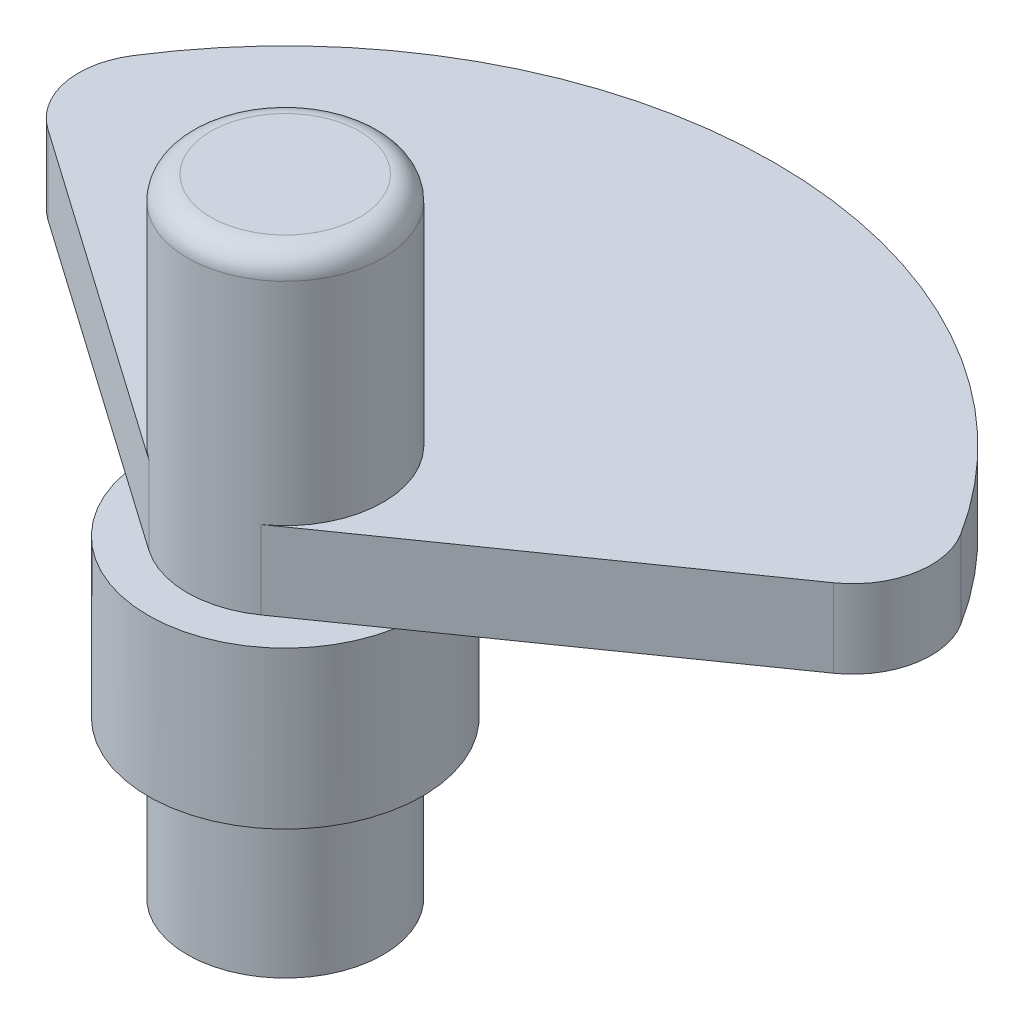
ISO-10303-21;
HEADER;
FILE_DESCRIPTION(('STEP AP214'),'2;1');
FILE_NAME('part.step','',(''),(''),'','','');
FILE_SCHEMA(('AUTOMOTIVE_DESIGN { 1 0 10303 214 1 1 1 1 }'));
ENDSEC;
DATA;
#1=APPLICATION_CONTEXT('core data for automotive mechanical design processes');
#2=APPLICATION_PROTOCOL_DEFINITION('international standard','automotive_design',2000,#1);
#3=PRODUCT_CONTEXT('',#1,'mechanical');
#4=PRODUCT('Part','Part','',(#3));
#5=PRODUCT_RELATED_PRODUCT_CATEGORY('part','',(#4));
#6=PRODUCT_DEFINITION_FORMATION('','',#4);
#7=PRODUCT_DEFINITION_CONTEXT('part definition',#1,'design');
#8=PRODUCT_DEFINITION('design','',#6,#7);
#9=PRODUCT_DEFINITION_SHAPE('','',#8);
#10=(LENGTH_UNIT() NAMED_UNIT(*) SI_UNIT(.MILLI.,.METRE.));
#11=(NAMED_UNIT(*) PLANE_ANGLE_UNIT() SI_UNIT($,.RADIAN.));
#12=(NAMED_UNIT(*) SI_UNIT($,.STERADIAN.) SOLID_ANGLE_UNIT());
#13=UNCERTAINTY_MEASURE_WITH_UNIT(LENGTH_MEASURE(1.E-05),#10,'distance_accuracy_value','');
#14=(GEOMETRIC_REPRESENTATION_CONTEXT(3) GLOBAL_UNCERTAINTY_ASSIGNED_CONTEXT((#13)) GLOBAL_UNIT_ASSIGNED_CONTEXT((#10,
#11,#12)) REPRESENTATION_CONTEXT('',''));
#15=CARTESIAN_POINT('',(0.,0.,0.));
#16=DIRECTION('',(0.,0.,1.));
#17=DIRECTION('',(1.,0.,0.));
#18=AXIS2_PLACEMENT_3D('',#15,#16,#17);
#19=CARTESIAN_POINT('',(0.,10.,0.));
#20=DIRECTION('',(0.,-1.,0.));
#21=DIRECTION('',(0.,0.,-1.));
#22=AXIS2_PLACEMENT_3D('',#19,#20,#21);
#23=CYLINDRICAL_SURFACE('',#22,12.5);
#24=CARTESIAN_POINT('',(0.,-20.,0.));
#25=DIRECTION('',(0.,-1.,0.));
#26=DIRECTION('',(0.,0.,-1.));
#27=AXIS2_PLACEMENT_3D('',#24,#25,#26);
#28=CIRCLE('',#27,12.5);
#29=CARTESIAN_POINT('',(0.,-20.,-12.5));
#30=VERTEX_POINT('',#29);
#31=EDGE_CURVE('E148',#30,#30,#28,.T.);
#32=ORIENTED_EDGE('',*,*,#31,.T.);
#33=EDGE_LOOP('',(#32));
#34=FACE_BOUND('',#33,.T.);
#35=CARTESIAN_POINT('',(0.,-40.,0.));
#36=DIRECTION('',(0.,1.,0.));
#37=DIRECTION('',(0.,0.,1.));
#38=AXIS2_PLACEMENT_3D('',#35,#36,#37);
#39=CIRCLE('',#38,12.5);
#40=CARTESIAN_POINT('',(0.,-40.,12.5));
#41=VERTEX_POINT('',#40);
#42=EDGE_CURVE('E150',#41,#41,#39,.T.);
#43=ORIENTED_EDGE('',*,*,#42,.T.);
#44=EDGE_LOOP('',(#43));
#45=FACE_BOUND('',#44,.T.);
#46=ADVANCED_FACE('F34',(#34,#45),#23,.T.);
#47=CARTESIAN_POINT('',(0.,-40.,0.));
#48=DIRECTION('',(0.,1.,0.));
#49=DIRECTION('',(0.,0.,1.));
#50=AXIS2_PLACEMENT_3D('',#47,#48,#49);
#51=PLANE('',#50);
#52=CARTESIAN_POINT('',(0.,-40.,9.));
#53=DIRECTION('',(0.,-1.,0.));
#54=DIRECTION('',(0.,0.,-1.));
#55=AXIS2_PLACEMENT_3D('',#52,#53,#54);
#56=CIRCLE('',#55,1.5);
#57=CARTESIAN_POINT('',(0.,-40.,7.5));
#58=VERTEX_POINT('',#57);
#59=EDGE_CURVE('E234',#58,#58,#56,.T.);
#60=ORIENTED_EDGE('',*,*,#59,.F.);
#61=EDGE_LOOP('',(#60));
#62=FACE_BOUND('',#61,.T.);
#63=CARTESIAN_POINT('',(9.,-40.,0.));
#64=DIRECTION('',(0.,-1.,0.));
#65=DIRECTION('',(0.,0.,-1.));
#66=AXIS2_PLACEMENT_3D('',#63,#64,#65);
#67=CIRCLE('',#66,1.5);
#68=CARTESIAN_POINT('',(9.,-40.,-1.5));
#69=VERTEX_POINT('',#68);
#70=EDGE_CURVE('E228',#69,#69,#67,.T.);
#71=ORIENTED_EDGE('',*,*,#70,.F.);
#72=EDGE_LOOP('',(#71));
#73=FACE_BOUND('',#72,.T.);
#74=CARTESIAN_POINT('',(0.,-40.,-9.));
#75=DIRECTION('',(0.,-1.,0.));
#76=DIRECTION('',(0.,0.,-1.));
#77=AXIS2_PLACEMENT_3D('',#74,#75,#76);
#78=CIRCLE('',#77,1.5);
#79=CARTESIAN_POINT('',(0.,-40.,-10.5));
#80=VERTEX_POINT('',#79);
#81=EDGE_CURVE('E222',#80,#80,#78,.T.);
#82=ORIENTED_EDGE('',*,*,#81,.F.);
#83=EDGE_LOOP('',(#82));
#84=FACE_BOUND('',#83,.T.);
#85=CARTESIAN_POINT('',(-9.,-40.,0.));
#86=DIRECTION('',(0.,-1.,0.));
#87=DIRECTION('',(0.,0.,-1.));
#88=AXIS2_PLACEMENT_3D('',#85,#86,#87);
#89=CIRCLE('',#88,1.5);
#90=CARTESIAN_POINT('',(-9.,-40.,-1.5));
#91=VERTEX_POINT('',#90);
#92=EDGE_CURVE('E216',#91,#91,#89,.T.);
#93=ORIENTED_EDGE('',*,*,#92,.F.);
#94=EDGE_LOOP('',(#93));
#95=FACE_BOUND('',#94,.T.);
#96=ORIENTED_EDGE('',*,*,#42,.F.);
#97=EDGE_LOOP('',(#96));
#98=FACE_BOUND('',#97,.T.);
#99=ADVANCED_FACE('F172',(#62,#73,#84,#95,#98),#51,.F.);
#100=CARTESIAN_POINT('',(0.,0.,0.));
#101=DIRECTION('',(0.,-1.,0.));
#102=DIRECTION('',(0.,0.,-1.));
#103=AXIS2_PLACEMENT_3D('',#100,#101,#102);
#104=PLANE('',#103);
#105=CARTESIAN_POINT('',(0.,0.,0.));
#106=DIRECTION('',(0.,-1.,0.));
#107=DIRECTION('',(0.,0.,-1.));
#108=AXIS2_PLACEMENT_3D('',#105,#106,#107);
#109=CIRCLE('',#108,12.5);
#110=CARTESIAN_POINT('',(7.16970545438801,0.,10.2394005536124));
#111=VERTEX_POINT('',#110);
#112=CARTESIAN_POINT('',(-7.16970545438801,0.,10.2394005536124));
#113=VERTEX_POINT('',#112);
#114=EDGE_CURVE('E151',#111,#113,#109,.T.);
#115=ORIENTED_EDGE('',*,*,#114,.T.);
#116=DIRECTION('',(0.819152044288995,0.,0.573576436351041));
#117=VECTOR('',#116,1.);
#118=CARTESIAN_POINT('',(-50.1264010567363,0.,-19.8392015237313));
#119=LINE('',#118,#117);
#120=CARTESIAN_POINT('',(-17.2022281057168,0.,3.21455256589241));
#121=VERTEX_POINT('',#120);
#122=EDGE_CURVE('E134',#121,#113,#119,.T.);
#123=ORIENTED_EDGE('',*,*,#122,.F.);
#124=CARTESIAN_POINT('',(0.,0.,0.));
#125=DIRECTION('',(0.,-1.,0.));
#126=DIRECTION('',(0.,0.,-1.));
#127=AXIS2_PLACEMENT_3D('',#124,#125,#126);
#128=CIRCLE('',#127,17.5);
#129=CARTESIAN_POINT('',(17.2022281057168,0.,3.21455256589241));
#130=VERTEX_POINT('',#129);
#131=EDGE_CURVE('E48',#130,#121,#128,.T.);
#132=ORIENTED_EDGE('',*,*,#131,.F.);
#133=DIRECTION('',(-0.819152044288995,0.,0.573576436351041));
#134=VECTOR('',#133,1.);
#135=CARTESIAN_POINT('',(50.1264010567363,0.,-19.8392015237314));
#136=LINE('',#135,#134);
#137=EDGE_CURVE('E132',#130,#111,#136,.T.);
#138=ORIENTED_EDGE('',*,*,#137,.T.);
#139=EDGE_LOOP('',(#115,#123,#132,#138));
#140=FACE_BOUND('',#139,.T.);
#141=ADVANCED_FACE('F178',(#140),#104,.F.);
#142=CARTESIAN_POINT('',(0.,-20.,0.));
#143=DIRECTION('',(0.,1.,0.));
#144=DIRECTION('',(0.,0.,1.));
#145=AXIS2_PLACEMENT_3D('',#142,#143,#144);
#146=CYLINDRICAL_SURFACE('',#145,17.5);
#147=CARTESIAN_POINT('',(0.,-20.,0.));
#148=DIRECTION('',(0.,-1.,0.));
#149=DIRECTION('',(0.,0.,-1.));
#150=AXIS2_PLACEMENT_3D('',#147,#148,#149);
#151=CIRCLE('',#150,17.5);
#152=CARTESIAN_POINT('',(0.,-20.,-17.5));
#153=VERTEX_POINT('',#152);
#154=EDGE_CURVE('E200',#153,#153,#151,.T.);
#155=ORIENTED_EDGE('',*,*,#154,.F.);
#156=EDGE_LOOP('',(#155));
#157=FACE_BOUND('',#156,.T.);
#158=ORIENTED_EDGE('',*,*,#131,.T.);
#159=CARTESIAN_POINT('',(0.,0.,0.));
#160=DIRECTION('',(0.,-1.,0.));
#161=DIRECTION('',(0.,0.,-1.));
#162=AXIS2_PLACEMENT_3D('',#159,#160,#161);
#163=CIRCLE('',#162,17.5);
#164=EDGE_CURVE('E139',#130,#121,#163,.F.);
#165=ORIENTED_EDGE('',*,*,#164,.F.);
#166=EDGE_LOOP('',(#158,#165));
#167=FACE_BOUND('',#166,.T.);
#168=ADVANCED_FACE('F278',(#157,#167),#146,.T.);
#169=CARTESIAN_POINT('',(0.,-20.,0.));
#170=DIRECTION('',(0.,-1.,0.));
#171=DIRECTION('',(0.,0.,-1.));
#172=AXIS2_PLACEMENT_3D('',#169,#170,#171);
#173=PLANE('',#172);
#174=ORIENTED_EDGE('',*,*,#31,.F.);
#175=EDGE_LOOP('',(#174));
#176=FACE_BOUND('',#175,.T.);
#177=ORIENTED_EDGE('',*,*,#154,.T.);
#178=EDGE_LOOP('',(#177));
#179=FACE_BOUND('',#178,.T.);
#180=ADVANCED_FACE('F275',(#176,#179),#173,.T.);
#181=CARTESIAN_POINT('',(0.,40.,0.));
#182=DIRECTION('',(0.,1.,0.));
#183=DIRECTION('',(0.,0.,1.));
#184=AXIS2_PLACEMENT_3D('',#181,#182,#183);
#185=PLANE('',#184);
#186=CARTESIAN_POINT('',(0.,40.,0.));
#187=DIRECTION('',(0.,1.,0.));
#188=DIRECTION('',(0.,0.,1.));
#189=AXIS2_PLACEMENT_3D('',#186,#187,#188);
#190=CIRCLE('',#189,9.49999999999999);
#191=CARTESIAN_POINT('',(0.,40.,9.49999999999999));
#192=VERTEX_POINT('',#191);
#193=EDGE_CURVE('E42',#192,#192,#190,.T.);
#194=ORIENTED_EDGE('',*,*,#193,.T.);
#195=EDGE_LOOP('',(#194));
#196=FACE_BOUND('',#195,.T.);
#197=ADVANCED_FACE('F155',(#196),#185,.T.);
#198=CARTESIAN_POINT('',(-44.3906366932259,10.,-28.0307219666213));
#199=DIRECTION('',(0.,-1.,0.));
#200=DIRECTION('',(0.,0.,-1.));
#201=AXIS2_PLACEMENT_3D('',#198,#199,#200);
#202=PLANE('',#201);
#203=DIRECTION('',(0.819152044288995,0.,0.573576436351041));
#204=VECTOR('',#203,1.);
#205=CARTESIAN_POINT('',(-50.1264010567363,10.,-19.8392015237313));
#206=LINE('',#205,#204);
#207=CARTESIAN_POINT('',(-50.1264010567363,10.,-19.8392015237313));
#208=VERTEX_POINT('',#207);
#209=CARTESIAN_POINT('',(-7.169705454388,10.,10.2394005536124));
#210=VERTEX_POINT('',#209);
#211=EDGE_CURVE('E118',#208,#210,#206,.T.);
#212=ORIENTED_EDGE('',*,*,#211,.T.);
#213=CARTESIAN_POINT('',(0.,10.,0.));
#214=DIRECTION('',(0.,-1.,0.));
#215=DIRECTION('',(0.,0.,-1.));
#216=AXIS2_PLACEMENT_3D('',#213,#214,#215);
#217=CIRCLE('',#216,12.5);
#218=CARTESIAN_POINT('',(7.16970545438801,10.,10.2394005536124));
#219=VERTEX_POINT('',#218);
#220=EDGE_CURVE('E116',#210,#219,#217,.T.);
#221=ORIENTED_EDGE('',*,*,#220,.T.);
#222=DIRECTION('',(-0.819152044288995,0.,0.573576436351041));
#223=VECTOR('',#222,1.);
#224=CARTESIAN_POINT('',(50.1264010567363,10.,-19.8392015237314));
#225=LINE('',#224,#223);
#226=CARTESIAN_POINT('',(50.1264010567363,10.,-19.8392015237314));
#227=VERTEX_POINT('',#226);
#228=EDGE_CURVE('E99',#227,#219,#225,.T.);
#229=ORIENTED_EDGE('',*,*,#228,.F.);
#230=CARTESIAN_POINT('',(44.3906366932259,10.,-28.0307219666213));
#231=DIRECTION('',(0.,1.,0.));
#232=DIRECTION('',(0.,0.,1.));
#233=AXIS2_PLACEMENT_3D('',#230,#231,#232);
#234=CIRCLE('',#233,10.);
#235=CARTESIAN_POINT('',(52.8459960633642,10.,-33.3699071031206));
#236=VERTEX_POINT('',#235);
#237=EDGE_CURVE('E109',#227,#236,#234,.T.);
#238=ORIENTED_EDGE('',*,*,#237,.T.);
#239=CARTESIAN_POINT('',(0.,10.,0.));
#240=DIRECTION('',(0.,1.,0.));
#241=DIRECTION('',(0.,0.,1.));
#242=AXIS2_PLACEMENT_3D('',#239,#240,#241);
#243=CIRCLE('',#242,62.5);
#244=CARTESIAN_POINT('',(-52.8459960633642,10.,-33.3699071031206));
#245=VERTEX_POINT('',#244);
#246=EDGE_CURVE('E85',#236,#245,#243,.T.);
#247=ORIENTED_EDGE('',*,*,#246,.T.);
#248=CARTESIAN_POINT('',(-44.3906366932259,10.,-28.0307219666213));
#249=DIRECTION('',(0.,-1.,0.));
#250=DIRECTION('',(0.,0.,-1.));
#251=AXIS2_PLACEMENT_3D('',#248,#249,#250);
#252=CIRCLE('',#251,10.);
#253=EDGE_CURVE('E137',#208,#245,#252,.T.);
#254=ORIENTED_EDGE('',*,*,#253,.F.);
#255=EDGE_LOOP('',(#212,#221,#229,#238,#247,#254));
#256=FACE_BOUND('',#255,.T.);
#257=ADVANCED_FACE('F114',(#256),#202,.F.);
#258=CARTESIAN_POINT('',(44.3906366932259,10.,-28.0307219666213));
#259=DIRECTION('',(0.,-1.,0.));
#260=DIRECTION('',(0.,0.,-1.));
#261=AXIS2_PLACEMENT_3D('',#258,#259,#260);
#262=CYLINDRICAL_SURFACE('',#261,10.);
#263=CARTESIAN_POINT('',(44.3906366932259,0.,-28.0307219666213));
#264=DIRECTION('',(0.,1.,0.));
#265=DIRECTION('',(0.,0.,1.));
#266=AXIS2_PLACEMENT_3D('',#263,#264,#265);
#267=CIRCLE('',#266,10.);
#268=CARTESIAN_POINT('',(50.1264010567363,0.,-19.8392015237314));
#269=VERTEX_POINT('',#268);
#270=CARTESIAN_POINT('',(52.8459960633642,0.,-33.3699071031206));
#271=VERTEX_POINT('',#270);
#272=EDGE_CURVE('E130',#269,#271,#267,.T.);
#273=ORIENTED_EDGE('',*,*,#272,.T.);
#274=DIRECTION('',(0.,-1.,0.));
#275=VECTOR('',#274,1.);
#276=CARTESIAN_POINT('',(52.8459960633642,10.,-33.3699071031206));
#277=LINE('',#276,#275);
#278=EDGE_CURVE('E106',#236,#271,#277,.T.);
#279=ORIENTED_EDGE('',*,*,#278,.F.);
#280=ORIENTED_EDGE('',*,*,#237,.F.);
#281=DIRECTION('',(0.,-1.,0.));
#282=VECTOR('',#281,1.);
#283=CARTESIAN_POINT('',(50.1264010567363,10.,-19.8392015237314));
#284=LINE('',#283,#282);
#285=EDGE_CURVE('E94',#227,#269,#284,.T.);
#286=ORIENTED_EDGE('',*,*,#285,.T.);
#287=EDGE_LOOP('',(#273,#279,#280,#286));
#288=FACE_BOUND('',#287,.T.);
#289=ADVANCED_FACE('F110',(#288),#262,.T.);
#290=CARTESIAN_POINT('',(0.,10.,0.));
#291=DIRECTION('',(0.,-1.,0.));
#292=DIRECTION('',(0.,0.,-1.));
#293=AXIS2_PLACEMENT_3D('',#290,#291,#292);
#294=CYLINDRICAL_SURFACE('',#293,62.5);
#295=CARTESIAN_POINT('',(0.,0.,0.));
#296=DIRECTION('',(0.,1.,0.));
#297=DIRECTION('',(0.,0.,1.));
#298=AXIS2_PLACEMENT_3D('',#295,#296,#297);
#299=CIRCLE('',#298,62.5);
#300=CARTESIAN_POINT('',(-52.8459960633642,0.,-33.3699071031206));
#301=VERTEX_POINT('',#300);
#302=EDGE_CURVE('E127',#271,#301,#299,.T.);
#303=ORIENTED_EDGE('',*,*,#302,.T.);
#304=DIRECTION('',(0.,-1.,0.));
#305=VECTOR('',#304,1.);
#306=CARTESIAN_POINT('',(-52.8459960633642,10.,-33.3699071031206));
#307=LINE('',#306,#305);
#308=EDGE_CURVE('E120',#245,#301,#307,.T.);
#309=ORIENTED_EDGE('',*,*,#308,.F.);
#310=ORIENTED_EDGE('',*,*,#246,.F.);
#311=ORIENTED_EDGE('',*,*,#278,.T.);
#312=EDGE_LOOP('',(#303,#309,#310,#311));
#313=FACE_BOUND('',#312,.T.);
#314=ADVANCED_FACE('F206',(#313),#294,.T.);
#315=CARTESIAN_POINT('',(-44.3906366932259,10.,-28.0307219666213));
#316=DIRECTION('',(0.,-1.,0.));
#317=DIRECTION('',(0.,0.,-1.));
#318=AXIS2_PLACEMENT_3D('',#315,#316,#317);
#319=CYLINDRICAL_SURFACE('',#318,10.);
#320=CARTESIAN_POINT('',(-44.3906366932259,0.,-28.0307219666213));
#321=DIRECTION('',(0.,-1.,0.));
#322=DIRECTION('',(0.,0.,-1.));
#323=AXIS2_PLACEMENT_3D('',#320,#321,#322);
#324=CIRCLE('',#323,10.);
#325=CARTESIAN_POINT('',(-50.1264010567363,0.,-19.8392015237313));
#326=VERTEX_POINT('',#325);
#327=EDGE_CURVE('E124',#326,#301,#324,.T.);
#328=ORIENTED_EDGE('',*,*,#327,.F.);
#329=DIRECTION('',(0.,-1.,0.));
#330=VECTOR('',#329,1.);
#331=CARTESIAN_POINT('',(-50.1264010567363,10.,-19.8392015237313));
#332=LINE('',#331,#330);
#333=EDGE_CURVE('E57',#208,#326,#332,.T.);
#334=ORIENTED_EDGE('',*,*,#333,.F.);
#335=ORIENTED_EDGE('',*,*,#253,.T.);
#336=ORIENTED_EDGE('',*,*,#308,.T.);
#337=EDGE_LOOP('',(#328,#334,#335,#336));
#338=FACE_BOUND('',#337,.T.);
#339=ADVANCED_FACE('F290',(#338),#319,.T.);
#340=CARTESIAN_POINT('',(-44.3906366932259,0.,-28.0307219666213));
#341=DIRECTION('',(0.,-1.,0.));
#342=DIRECTION('',(0.,0.,-1.));
#343=AXIS2_PLACEMENT_3D('',#340,#341,#342);
#344=PLANE('',#343);
#345=EDGE_CURVE('E102',#269,#130,#136,.T.);
#346=ORIENTED_EDGE('',*,*,#345,.T.);
#347=ORIENTED_EDGE('',*,*,#164,.T.);
#348=EDGE_CURVE('E135',#326,#121,#119,.T.);
#349=ORIENTED_EDGE('',*,*,#348,.F.);
#350=ORIENTED_EDGE('',*,*,#327,.T.);
#351=ORIENTED_EDGE('',*,*,#302,.F.);
#352=ORIENTED_EDGE('',*,*,#272,.F.);
#353=EDGE_LOOP('',(#346,#347,#349,#350,#351,#352));
#354=FACE_BOUND('',#353,.T.);
#355=ADVANCED_FACE('F188',(#354),#344,.T.);
#356=CARTESIAN_POINT('',(50.1264010567363,10.,-19.8392015237314));
#357=DIRECTION('',(0.573576436351041,0.,0.819152044288995));
#358=DIRECTION('',(0.819152044288995,0.,-0.573576436351041));
#359=AXIS2_PLACEMENT_3D('',#356,#357,#358);
#360=PLANE('',#359);
#361=ORIENTED_EDGE('',*,*,#345,.F.);
#362=ORIENTED_EDGE('',*,*,#285,.F.);
#363=ORIENTED_EDGE('',*,*,#228,.T.);
#364=DIRECTION('',(0.,-1.,0.));
#365=VECTOR('',#364,1.);
#366=CARTESIAN_POINT('',(7.16970545438801,10.,10.2394005536124));
#367=LINE('',#366,#365);
#368=EDGE_CURVE('E105',#219,#111,#367,.T.);
#369=ORIENTED_EDGE('',*,*,#368,.T.);
#370=ORIENTED_EDGE('',*,*,#137,.F.);
#371=EDGE_LOOP('',(#361,#362,#363,#369,#370));
#372=FACE_BOUND('',#371,.T.);
#373=ADVANCED_FACE('F96',(#372),#360,.T.);
#374=CARTESIAN_POINT('',(0.,37.,0.));
#375=DIRECTION('',(0.,1.,0.));
#376=DIRECTION('',(0.,0.,1.));
#377=AXIS2_PLACEMENT_3D('',#374,#375,#376);
#378=CIRCLE('',#377,12.5);
#379=CARTESIAN_POINT('',(0.,37.,12.5));
#380=VERTEX_POINT('',#379);
#381=EDGE_CURVE('E11',#380,#380,#378,.F.);
#382=ORIENTED_EDGE('',*,*,#381,.T.);
#383=EDGE_LOOP('',(#382));
#384=FACE_BOUND('',#383,.T.);
#385=ORIENTED_EDGE('',*,*,#114,.F.);
#386=ORIENTED_EDGE('',*,*,#368,.F.);
#387=ORIENTED_EDGE('',*,*,#220,.F.);
#388=DIRECTION('',(0.,-1.,0.));
#389=VECTOR('',#388,1.);
#390=CARTESIAN_POINT('',(-7.16970545438801,10.,10.2394005536124));
#391=LINE('',#390,#389);
#392=EDGE_CURVE('E140',#210,#113,#391,.T.);
#393=ORIENTED_EDGE('',*,*,#392,.T.);
#394=EDGE_LOOP('',(#385,#386,#387,#393));
#395=FACE_BOUND('',#394,.T.);
#396=ADVANCED_FACE('F168',(#384,#395),#23,.T.);
#397=CARTESIAN_POINT('',(-50.1264010567363,10.,-19.8392015237313));
#398=DIRECTION('',(0.573576436351041,0.,-0.819152044288995));
#399=DIRECTION('',(-0.819152044288995,0.,-0.573576436351041));
#400=AXIS2_PLACEMENT_3D('',#397,#398,#399);
#401=PLANE('',#400);
#402=ORIENTED_EDGE('',*,*,#348,.T.);
#403=ORIENTED_EDGE('',*,*,#122,.T.);
#404=ORIENTED_EDGE('',*,*,#392,.F.);
#405=ORIENTED_EDGE('',*,*,#211,.F.);
#406=ORIENTED_EDGE('',*,*,#333,.T.);
#407=EDGE_LOOP('',(#402,#403,#404,#405,#406));
#408=FACE_BOUND('',#407,.T.);
#409=ADVANCED_FACE('F159',(#408),#401,.F.);
#410=CARTESIAN_POINT('',(0.,37.,0.));
#411=DIRECTION('',(0.,1.,0.));
#412=DIRECTION('',(0.,0.,1.));
#413=AXIS2_PLACEMENT_3D('',#410,#411,#412);
#414=TOROIDAL_SURFACE('',#413,9.49999999999999,3.);
#415=ORIENTED_EDGE('',*,*,#381,.F.);
#416=EDGE_LOOP('',(#415));
#417=FACE_BOUND('',#416,.T.);
#418=ORIENTED_EDGE('',*,*,#193,.F.);
#419=EDGE_LOOP('',(#418));
#420=FACE_BOUND('',#419,.T.);
#421=ADVANCED_FACE('F36',(#417,#420),#414,.T.);
#422=CARTESIAN_POINT('',(-9.,-30.,0.));
#423=DIRECTION('',(0.,-1.,0.));
#424=DIRECTION('',(0.,0.,-1.));
#425=AXIS2_PLACEMENT_3D('',#422,#423,#424);
#426=CYLINDRICAL_SURFACE('',#425,1.5);
#427=CARTESIAN_POINT('',(-9.,-30.,0.));
#428=DIRECTION('',(0.,-1.,0.));
#429=DIRECTION('',(0.,0.,-1.));
#430=AXIS2_PLACEMENT_3D('',#427,#428,#429);
#431=CIRCLE('',#430,1.5);
#432=CARTESIAN_POINT('',(-9.,-30.,-1.5));
#433=VERTEX_POINT('',#432);
#434=EDGE_CURVE('E219',#433,#433,#431,.T.);
#435=ORIENTED_EDGE('',*,*,#434,.F.);
#436=EDGE_LOOP('',(#435));
#437=FACE_BOUND('',#436,.T.);
#438=ORIENTED_EDGE('',*,*,#92,.T.);
#439=EDGE_LOOP('',(#438));
#440=FACE_BOUND('',#439,.T.);
#441=ADVANCED_FACE('F158',(#437,#440),#426,.F.);
#442=CARTESIAN_POINT('',(-9.,-30.,0.));
#443=DIRECTION('',(0.,-1.,0.));
#444=DIRECTION('',(0.,0.,-1.));
#445=AXIS2_PLACEMENT_3D('',#442,#443,#444);
#446=PLANE('',#445);
#447=ORIENTED_EDGE('',*,*,#434,.T.);
#448=EDGE_LOOP('',(#447));
#449=FACE_BOUND('',#448,.T.);
#450=ADVANCED_FACE('F165',(#449),#446,.T.);
#451=CARTESIAN_POINT('',(0.,-30.,-9.));
#452=DIRECTION('',(0.,-1.,0.));
#453=DIRECTION('',(0.,0.,-1.));
#454=AXIS2_PLACEMENT_3D('',#451,#452,#453);
#455=CYLINDRICAL_SURFACE('',#454,1.5);
#456=CARTESIAN_POINT('',(0.,-30.,-9.));
#457=DIRECTION('',(0.,-1.,0.));
#458=DIRECTION('',(0.,0.,-1.));
#459=AXIS2_PLACEMENT_3D('',#456,#457,#458);
#460=CIRCLE('',#459,1.5);
#461=CARTESIAN_POINT('',(0.,-30.,-10.5));
#462=VERTEX_POINT('',#461);
#463=EDGE_CURVE('E225',#462,#462,#460,.T.);
#464=ORIENTED_EDGE('',*,*,#463,.F.);
#465=EDGE_LOOP('',(#464));
#466=FACE_BOUND('',#465,.T.);
#467=ORIENTED_EDGE('',*,*,#81,.T.);
#468=EDGE_LOOP('',(#467));
#469=FACE_BOUND('',#468,.T.);
#470=ADVANCED_FACE('F258',(#466,#469),#455,.F.);
#471=CARTESIAN_POINT('',(0.,-30.,-9.));
#472=DIRECTION('',(0.,-1.,0.));
#473=DIRECTION('',(0.,0.,-1.));
#474=AXIS2_PLACEMENT_3D('',#471,#472,#473);
#475=PLANE('',#474);
#476=ORIENTED_EDGE('',*,*,#463,.T.);
#477=EDGE_LOOP('',(#476));
#478=FACE_BOUND('',#477,.T.);
#479=ADVANCED_FACE('F260',(#478),#475,.T.);
#480=CARTESIAN_POINT('',(9.,-30.,0.));
#481=DIRECTION('',(0.,-1.,0.));
#482=DIRECTION('',(0.,0.,-1.));
#483=AXIS2_PLACEMENT_3D('',#480,#481,#482);
#484=CYLINDRICAL_SURFACE('',#483,1.5);
#485=CARTESIAN_POINT('',(9.,-30.,0.));
#486=DIRECTION('',(0.,-1.,0.));
#487=DIRECTION('',(0.,0.,-1.));
#488=AXIS2_PLACEMENT_3D('',#485,#486,#487);
#489=CIRCLE('',#488,1.5);
#490=CARTESIAN_POINT('',(9.,-30.,-1.5));
#491=VERTEX_POINT('',#490);
#492=EDGE_CURVE('E231',#491,#491,#489,.T.);
#493=ORIENTED_EDGE('',*,*,#492,.F.);
#494=EDGE_LOOP('',(#493));
#495=FACE_BOUND('',#494,.T.);
#496=ORIENTED_EDGE('',*,*,#70,.T.);
#497=EDGE_LOOP('',(#496));
#498=FACE_BOUND('',#497,.T.);
#499=ADVANCED_FACE('F267',(#495,#498),#484,.F.);
#500=CARTESIAN_POINT('',(9.,-30.,0.));
#501=DIRECTION('',(0.,-1.,0.));
#502=DIRECTION('',(0.,0.,-1.));
#503=AXIS2_PLACEMENT_3D('',#500,#501,#502);
#504=PLANE('',#503);
#505=ORIENTED_EDGE('',*,*,#492,.T.);
#506=EDGE_LOOP('',(#505));
#507=FACE_BOUND('',#506,.T.);
#508=ADVANCED_FACE('F245',(#507),#504,.T.);
#509=CARTESIAN_POINT('',(0.,-30.,9.));
#510=DIRECTION('',(0.,-1.,0.));
#511=DIRECTION('',(0.,0.,-1.));
#512=AXIS2_PLACEMENT_3D('',#509,#510,#511);
#513=CYLINDRICAL_SURFACE('',#512,1.5);
#514=CARTESIAN_POINT('',(0.,-30.,9.));
#515=DIRECTION('',(0.,-1.,0.));
#516=DIRECTION('',(0.,0.,-1.));
#517=AXIS2_PLACEMENT_3D('',#514,#515,#516);
#518=CIRCLE('',#517,1.5);
#519=CARTESIAN_POINT('',(0.,-30.,7.5));
#520=VERTEX_POINT('',#519);
#521=EDGE_CURVE('E213',#520,#520,#518,.T.);
#522=ORIENTED_EDGE('',*,*,#521,.F.);
#523=EDGE_LOOP('',(#522));
#524=FACE_BOUND('',#523,.T.);
#525=ORIENTED_EDGE('',*,*,#59,.T.);
#526=EDGE_LOOP('',(#525));
#527=FACE_BOUND('',#526,.T.);
#528=ADVANCED_FACE('F242',(#524,#527),#513,.F.);
#529=CARTESIAN_POINT('',(0.,-30.,9.));
#530=DIRECTION('',(0.,-1.,0.));
#531=DIRECTION('',(0.,0.,-1.));
#532=AXIS2_PLACEMENT_3D('',#529,#530,#531);
#533=PLANE('',#532);
#534=ORIENTED_EDGE('',*,*,#521,.T.);
#535=EDGE_LOOP('',(#534));
#536=FACE_BOUND('',#535,.T.);
#537=ADVANCED_FACE('F240',(#536),#533,.T.);
#538=CLOSED_SHELL('',(#46,#99,#141,#168,#180,#197,#257,#289,#314,#339,#355,#373,#396,#409,#421,
#441,#450,#470,#479,#499,#508,#528,#537));
#539=MANIFOLD_SOLID_BREP('B2',#538);
#540=ADVANCED_BREP_SHAPE_REPRESENTATION('',(#18,#539),#14);
#541=SHAPE_DEFINITION_REPRESENTATION(#9,#540);
ENDSEC;
END-ISO-10303-21;
